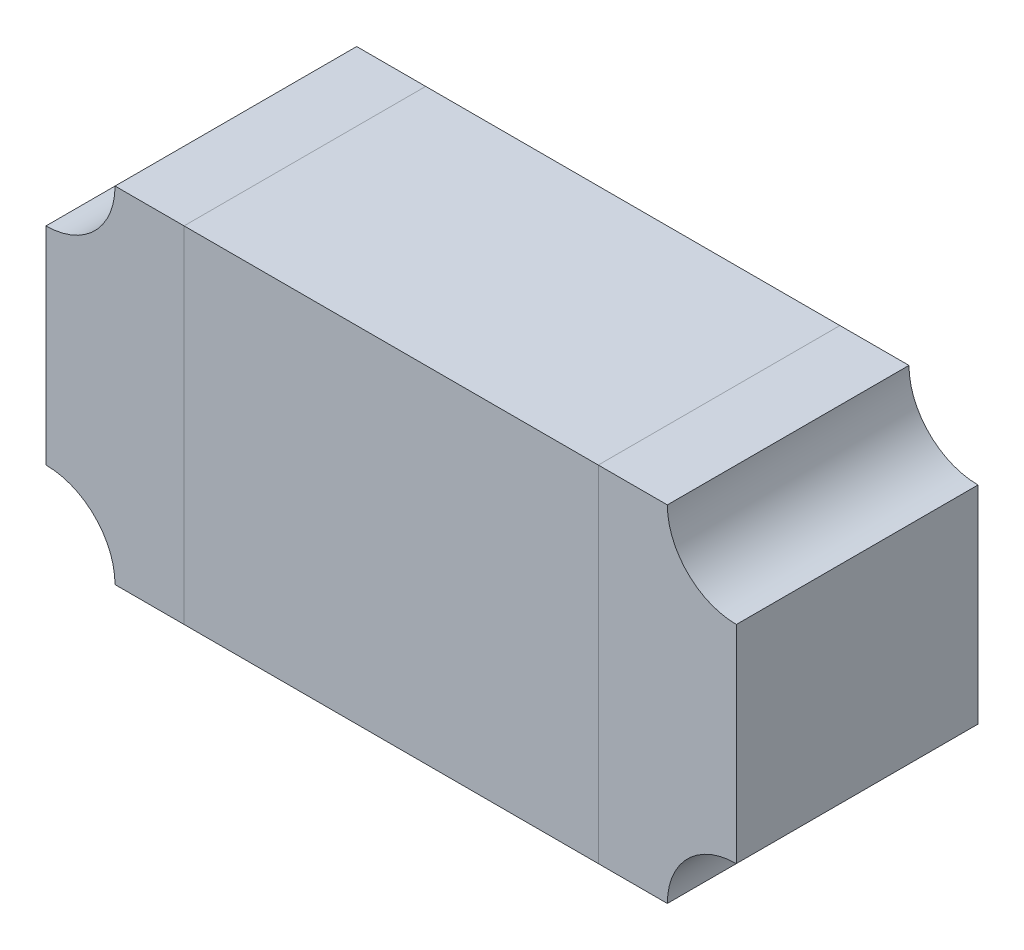
ISO-10303-21;
HEADER;
FILE_DESCRIPTION(('STEP AP214'),'2;1');
FILE_NAME('part.step','',(''),(''),'','','');
FILE_SCHEMA(('AUTOMOTIVE_DESIGN { 1 0 10303 214 1 1 1 1 }'));
ENDSEC;
DATA;
#1=APPLICATION_CONTEXT('core data for automotive mechanical design processes');
#2=APPLICATION_PROTOCOL_DEFINITION('international standard','automotive_design',2000,#1);
#3=PRODUCT_CONTEXT('',#1,'mechanical');
#4=PRODUCT('Part','Part','',(#3));
#5=PRODUCT_RELATED_PRODUCT_CATEGORY('part','',(#4));
#6=PRODUCT_DEFINITION_FORMATION('','',#4);
#7=PRODUCT_DEFINITION_CONTEXT('part definition',#1,'design');
#8=PRODUCT_DEFINITION('design','',#6,#7);
#9=PRODUCT_DEFINITION_SHAPE('','',#8);
#10=(LENGTH_UNIT() NAMED_UNIT(*) SI_UNIT(.MILLI.,.METRE.));
#11=(NAMED_UNIT(*) PLANE_ANGLE_UNIT() SI_UNIT($,.RADIAN.));
#12=(NAMED_UNIT(*) SI_UNIT($,.STERADIAN.) SOLID_ANGLE_UNIT());
#13=UNCERTAINTY_MEASURE_WITH_UNIT(LENGTH_MEASURE(1.E-05),#10,'distance_accuracy_value','');
#14=(GEOMETRIC_REPRESENTATION_CONTEXT(3) GLOBAL_UNCERTAINTY_ASSIGNED_CONTEXT((#13)) GLOBAL_UNIT_ASSIGNED_CONTEXT((#10,
#11,#12)) REPRESENTATION_CONTEXT('',''));
#15=CARTESIAN_POINT('',(0.,0.,0.));
#16=DIRECTION('',(0.,0.,1.));
#17=DIRECTION('',(1.,0.,0.));
#18=AXIS2_PLACEMENT_3D('',#15,#16,#17);
#19=CARTESIAN_POINT('',(0.5,0.25,0.));
#20=DIRECTION('',(0.,0.,-1.));
#21=DIRECTION('',(-1.,0.,0.));
#22=AXIS2_PLACEMENT_3D('',#19,#20,#21);
#23=PLANE('',#22);
#24=CARTESIAN_POINT('',(0.5,0.25,0.));
#25=DIRECTION('',(0.,0.,-1.));
#26=DIRECTION('',(-1.,0.,0.));
#27=AXIS2_PLACEMENT_3D('',#24,#25,#26);
#28=CIRCLE('',#27,0.1);
#29=CARTESIAN_POINT('',(0.5,0.15,0.));
#30=VERTEX_POINT('',#29);
#31=CARTESIAN_POINT('',(0.4,0.25,0.));
#32=VERTEX_POINT('',#31);
#33=EDGE_CURVE('E112',#30,#32,#28,.T.);
#34=ORIENTED_EDGE('',*,*,#33,.F.);
#35=DIRECTION('',(0.,1.,0.));
#36=VECTOR('',#35,1.);
#37=CARTESIAN_POINT('',(0.5,-0.15,0.));
#38=LINE('',#37,#36);
#39=CARTESIAN_POINT('',(0.5,-0.15,0.));
#40=VERTEX_POINT('',#39);
#41=EDGE_CURVE('E130',#40,#30,#38,.T.);
#42=ORIENTED_EDGE('',*,*,#41,.F.);
#43=CARTESIAN_POINT('',(0.5,-0.25,0.));
#44=DIRECTION('',(0.,0.,-1.));
#45=DIRECTION('',(1.,0.,0.));
#46=AXIS2_PLACEMENT_3D('',#43,#44,#45);
#47=CIRCLE('',#46,0.1);
#48=CARTESIAN_POINT('',(0.4,-0.25,0.));
#49=VERTEX_POINT('',#48);
#50=EDGE_CURVE('E127',#49,#40,#47,.T.);
#51=ORIENTED_EDGE('',*,*,#50,.F.);
#52=DIRECTION('',(1.,0.,0.));
#53=VECTOR('',#52,1.);
#54=CARTESIAN_POINT('',(0.3,-0.25,0.));
#55=LINE('',#54,#53);
#56=CARTESIAN_POINT('',(0.3,-0.25,0.));
#57=VERTEX_POINT('',#56);
#58=EDGE_CURVE('E124',#57,#49,#55,.T.);
#59=ORIENTED_EDGE('',*,*,#58,.F.);
#60=DIRECTION('',(0.,-1.,0.));
#61=VECTOR('',#60,1.);
#62=CARTESIAN_POINT('',(0.3,0.25,0.));
#63=LINE('',#62,#61);
#64=CARTESIAN_POINT('',(0.3,0.25,0.));
#65=VERTEX_POINT('',#64);
#66=EDGE_CURVE('E115',#65,#57,#63,.T.);
#67=ORIENTED_EDGE('',*,*,#66,.F.);
#68=DIRECTION('',(-1.,0.,0.));
#69=VECTOR('',#68,1.);
#70=CARTESIAN_POINT('',(0.4,0.25,0.));
#71=LINE('',#70,#69);
#72=EDGE_CURVE('E104',#32,#65,#71,.T.);
#73=ORIENTED_EDGE('',*,*,#72,.F.);
#74=EDGE_LOOP('',(#34,#42,#51,#59,#67,#73));
#75=FACE_BOUND('',#74,.T.);
#76=ADVANCED_FACE('F48',(#75),#23,.T.);
#77=CARTESIAN_POINT('',(0.5,-0.15,0.88851648071345));
#78=DIRECTION('',(-1.,0.,0.));
#79=DIRECTION('',(0.,-1.,0.));
#80=AXIS2_PLACEMENT_3D('',#77,#78,#79);
#81=PLANE('',#80);
#82=DIRECTION('',(0.,0.,-1.));
#83=VECTOR('',#82,1.);
#84=CARTESIAN_POINT('',(0.5,0.15,0.88851648071345));
#85=LINE('',#84,#83);
#86=CARTESIAN_POINT('',(0.5,0.15,0.35));
#87=VERTEX_POINT('',#86);
#88=EDGE_CURVE('E118',#87,#30,#85,.T.);
#89=ORIENTED_EDGE('',*,*,#88,.F.);
#90=DIRECTION('',(0.,-1.,0.));
#91=VECTOR('',#90,1.);
#92=CARTESIAN_POINT('',(0.5,-0.15,0.35));
#93=LINE('',#92,#91);
#94=CARTESIAN_POINT('',(0.5,-0.15,0.35));
#95=VERTEX_POINT('',#94);
#96=EDGE_CURVE('E52',#87,#95,#93,.T.);
#97=ORIENTED_EDGE('',*,*,#96,.T.);
#98=DIRECTION('',(0.,0.,-1.));
#99=VECTOR('',#98,1.);
#100=CARTESIAN_POINT('',(0.5,-0.15,0.88851648071345));
#101=LINE('',#100,#99);
#102=EDGE_CURVE('E133',#95,#40,#101,.T.);
#103=ORIENTED_EDGE('',*,*,#102,.T.);
#104=ORIENTED_EDGE('',*,*,#41,.T.);
#105=EDGE_LOOP('',(#89,#97,#103,#104));
#106=FACE_BOUND('',#105,.T.);
#107=ADVANCED_FACE('F152',(#106),#81,.F.);
#108=CARTESIAN_POINT('',(0.5,-0.25,0.88851648071345));
#109=DIRECTION('',(0.,0.,-1.));
#110=DIRECTION('',(-1.,0.,0.));
#111=AXIS2_PLACEMENT_3D('',#108,#109,#110);
#112=CYLINDRICAL_SURFACE('',#111,0.1);
#113=ORIENTED_EDGE('',*,*,#102,.F.);
#114=CARTESIAN_POINT('',(0.5,-0.25,0.35));
#115=DIRECTION('',(0.,0.,-1.));
#116=DIRECTION('',(-1.,0.,0.));
#117=AXIS2_PLACEMENT_3D('',#114,#115,#116);
#118=CIRCLE('',#117,0.1);
#119=CARTESIAN_POINT('',(0.4,-0.25,0.35));
#120=VERTEX_POINT('',#119);
#121=EDGE_CURVE('E144',#95,#120,#118,.F.);
#122=ORIENTED_EDGE('',*,*,#121,.T.);
#123=DIRECTION('',(0.,0.,-1.));
#124=VECTOR('',#123,1.);
#125=CARTESIAN_POINT('',(0.4,-0.25,0.88851648071345));
#126=LINE('',#125,#124);
#127=EDGE_CURVE('E135',#120,#49,#126,.T.);
#128=ORIENTED_EDGE('',*,*,#127,.T.);
#129=ORIENTED_EDGE('',*,*,#50,.T.);
#130=EDGE_LOOP('',(#113,#122,#128,#129));
#131=FACE_BOUND('',#130,.T.);
#132=ADVANCED_FACE('F155',(#131),#112,.F.);
#133=CARTESIAN_POINT('',(0.3,-0.25,0.88851648071345));
#134=DIRECTION('',(0.,1.,0.));
#135=DIRECTION('',(0.,0.,1.));
#136=AXIS2_PLACEMENT_3D('',#133,#134,#135);
#137=PLANE('',#136);
#138=ORIENTED_EDGE('',*,*,#127,.F.);
#139=DIRECTION('',(-1.,0.,0.));
#140=VECTOR('',#139,1.);
#141=CARTESIAN_POINT('',(0.3,-0.25,0.35));
#142=LINE('',#141,#140);
#143=CARTESIAN_POINT('',(0.3,-0.25,0.35));
#144=VERTEX_POINT('',#143);
#145=EDGE_CURVE('E142',#120,#144,#142,.T.);
#146=ORIENTED_EDGE('',*,*,#145,.T.);
#147=DIRECTION('',(0.,0.,-1.));
#148=VECTOR('',#147,1.);
#149=CARTESIAN_POINT('',(0.3,-0.25,0.88851648071345));
#150=LINE('',#149,#148);
#151=EDGE_CURVE('E137',#144,#57,#150,.T.);
#152=ORIENTED_EDGE('',*,*,#151,.T.);
#153=ORIENTED_EDGE('',*,*,#58,.T.);
#154=EDGE_LOOP('',(#138,#146,#152,#153));
#155=FACE_BOUND('',#154,.T.);
#156=ADVANCED_FACE('F158',(#155),#137,.F.);
#157=CARTESIAN_POINT('',(0.3,0.25,0.88851648071345));
#158=DIRECTION('',(1.,0.,0.));
#159=DIRECTION('',(0.,0.,-1.));
#160=AXIS2_PLACEMENT_3D('',#157,#158,#159);
#161=PLANE('',#160);
#162=ORIENTED_EDGE('',*,*,#151,.F.);
#163=DIRECTION('',(0.,1.,0.));
#164=VECTOR('',#163,1.);
#165=CARTESIAN_POINT('',(0.3,0.25,0.35));
#166=LINE('',#165,#164);
#167=CARTESIAN_POINT('',(0.3,0.25,0.35));
#168=VERTEX_POINT('',#167);
#169=EDGE_CURVE('E69',#144,#168,#166,.T.);
#170=ORIENTED_EDGE('',*,*,#169,.T.);
#171=DIRECTION('',(0.,0.,-1.));
#172=VECTOR('',#171,1.);
#173=CARTESIAN_POINT('',(0.3,0.25,0.88851648071345));
#174=LINE('',#173,#172);
#175=EDGE_CURVE('E108',#168,#65,#174,.T.);
#176=ORIENTED_EDGE('',*,*,#175,.T.);
#177=ORIENTED_EDGE('',*,*,#66,.T.);
#178=EDGE_LOOP('',(#162,#170,#176,#177));
#179=FACE_BOUND('',#178,.T.);
#180=ADVANCED_FACE('F140',(#179),#161,.F.);
#181=CARTESIAN_POINT('',(0.4,0.25,0.88851648071345));
#182=DIRECTION('',(0.,-1.,0.));
#183=DIRECTION('',(0.,0.,-1.));
#184=AXIS2_PLACEMENT_3D('',#181,#182,#183);
#185=PLANE('',#184);
#186=ORIENTED_EDGE('',*,*,#175,.F.);
#187=DIRECTION('',(1.,0.,0.));
#188=VECTOR('',#187,1.);
#189=CARTESIAN_POINT('',(0.4,0.25,0.35));
#190=LINE('',#189,#188);
#191=CARTESIAN_POINT('',(0.4,0.25,0.35));
#192=VERTEX_POINT('',#191);
#193=EDGE_CURVE('E57',#168,#192,#190,.T.);
#194=ORIENTED_EDGE('',*,*,#193,.T.);
#195=DIRECTION('',(0.,0.,-1.));
#196=VECTOR('',#195,1.);
#197=CARTESIAN_POINT('',(0.4,0.25,0.88851648071345));
#198=LINE('',#197,#196);
#199=EDGE_CURVE('E101',#192,#32,#198,.T.);
#200=ORIENTED_EDGE('',*,*,#199,.T.);
#201=ORIENTED_EDGE('',*,*,#72,.T.);
#202=EDGE_LOOP('',(#186,#194,#200,#201));
#203=FACE_BOUND('',#202,.T.);
#204=ADVANCED_FACE('F103',(#203),#185,.F.);
#205=CARTESIAN_POINT('',(0.5,0.25,0.88851648071345));
#206=DIRECTION('',(0.,0.,-1.));
#207=DIRECTION('',(-1.,0.,0.));
#208=AXIS2_PLACEMENT_3D('',#205,#206,#207);
#209=CYLINDRICAL_SURFACE('',#208,0.1);
#210=ORIENTED_EDGE('',*,*,#199,.F.);
#211=CARTESIAN_POINT('',(0.5,0.25,0.35));
#212=DIRECTION('',(0.,0.,-1.));
#213=DIRECTION('',(-1.,0.,0.));
#214=AXIS2_PLACEMENT_3D('',#211,#212,#213);
#215=CIRCLE('',#214,0.1);
#216=EDGE_CURVE('E12',#192,#87,#215,.F.);
#217=ORIENTED_EDGE('',*,*,#216,.T.);
#218=ORIENTED_EDGE('',*,*,#88,.T.);
#219=ORIENTED_EDGE('',*,*,#33,.T.);
#220=EDGE_LOOP('',(#210,#217,#218,#219));
#221=FACE_BOUND('',#220,.T.);
#222=ADVANCED_FACE('F50',(#221),#209,.F.);
#223=CARTESIAN_POINT('',(0.,0.,0.35));
#224=DIRECTION('',(0.,0.,-1.));
#225=DIRECTION('',(-1.,0.,0.));
#226=AXIS2_PLACEMENT_3D('',#223,#224,#225);
#227=PLANE('',#226);
#228=ORIENTED_EDGE('',*,*,#193,.F.);
#229=ORIENTED_EDGE('',*,*,#169,.F.);
#230=ORIENTED_EDGE('',*,*,#145,.F.);
#231=ORIENTED_EDGE('',*,*,#121,.F.);
#232=ORIENTED_EDGE('',*,*,#96,.F.);
#233=ORIENTED_EDGE('',*,*,#216,.F.);
#234=EDGE_LOOP('',(#228,#229,#230,#231,#232,#233));
#235=FACE_BOUND('',#234,.T.);
#236=ADVANCED_FACE('F153',(#235),#227,.F.);
#237=CLOSED_SHELL('',(#76,#107,#132,#156,#180,#204,#222,#236));
#238=MANIFOLD_SOLID_BREP('B2',#237);
#239=CARTESIAN_POINT('',(-0.5,-0.25,0.));
#240=DIRECTION('',(0.,0.,-1.));
#241=DIRECTION('',(-1.,0.,0.));
#242=AXIS2_PLACEMENT_3D('',#239,#240,#241);
#243=PLANE('',#242);
#244=DIRECTION('',(0.,1.,0.));
#245=VECTOR('',#244,1.);
#246=CARTESIAN_POINT('',(-0.3,0.25,0.));
#247=LINE('',#246,#245);
#248=CARTESIAN_POINT('',(-0.3,-0.25,0.));
#249=VERTEX_POINT('',#248);
#250=CARTESIAN_POINT('',(-0.3,0.25,0.));
#251=VERTEX_POINT('',#250);
#252=EDGE_CURVE('E297',#249,#251,#247,.T.);
#253=ORIENTED_EDGE('',*,*,#252,.F.);
#254=DIRECTION('',(1.,0.,0.));
#255=VECTOR('',#254,1.);
#256=CARTESIAN_POINT('',(-0.3,-0.25,0.));
#257=LINE('',#256,#255);
#258=CARTESIAN_POINT('',(-0.4,-0.25,0.));
#259=VERTEX_POINT('',#258);
#260=EDGE_CURVE('E315',#259,#249,#257,.T.);
#261=ORIENTED_EDGE('',*,*,#260,.F.);
#262=CARTESIAN_POINT('',(-0.5,-0.25,0.));
#263=DIRECTION('',(0.,0.,-1.));
#264=DIRECTION('',(-1.,0.,0.));
#265=AXIS2_PLACEMENT_3D('',#262,#263,#264);
#266=CIRCLE('',#265,0.1);
#267=CARTESIAN_POINT('',(-0.5,-0.15,0.));
#268=VERTEX_POINT('',#267);
#269=EDGE_CURVE('E312',#268,#259,#266,.T.);
#270=ORIENTED_EDGE('',*,*,#269,.F.);
#271=DIRECTION('',(0.,-1.,0.));
#272=VECTOR('',#271,1.);
#273=CARTESIAN_POINT('',(-0.5,-0.15,0.));
#274=LINE('',#273,#272);
#275=CARTESIAN_POINT('',(-0.5,0.15,0.));
#276=VERTEX_POINT('',#275);
#277=EDGE_CURVE('E309',#276,#268,#274,.T.);
#278=ORIENTED_EDGE('',*,*,#277,.F.);
#279=CARTESIAN_POINT('',(-0.5,0.25,0.));
#280=DIRECTION('',(0.,0.,-1.));
#281=DIRECTION('',(1.,0.,0.));
#282=AXIS2_PLACEMENT_3D('',#279,#280,#281);
#283=CIRCLE('',#282,0.1);
#284=CARTESIAN_POINT('',(-0.4,0.25,0.));
#285=VERTEX_POINT('',#284);
#286=EDGE_CURVE('E300',#285,#276,#283,.T.);
#287=ORIENTED_EDGE('',*,*,#286,.F.);
#288=DIRECTION('',(-1.,0.,0.));
#289=VECTOR('',#288,1.);
#290=CARTESIAN_POINT('',(-0.4,0.25,0.));
#291=LINE('',#290,#289);
#292=EDGE_CURVE('E289',#251,#285,#291,.T.);
#293=ORIENTED_EDGE('',*,*,#292,.F.);
#294=EDGE_LOOP('',(#253,#261,#270,#278,#287,#293));
#295=FACE_BOUND('',#294,.T.);
#296=ADVANCED_FACE('F233',(#295),#243,.T.);
#297=CARTESIAN_POINT('',(-0.3,-0.25,0.88851648071345));
#298=DIRECTION('',(0.,1.,0.));
#299=DIRECTION('',(0.,0.,1.));
#300=AXIS2_PLACEMENT_3D('',#297,#298,#299);
#301=PLANE('',#300);
#302=DIRECTION('',(0.,0.,-1.));
#303=VECTOR('',#302,1.);
#304=CARTESIAN_POINT('',(-0.3,-0.25,0.88851648071345));
#305=LINE('',#304,#303);
#306=CARTESIAN_POINT('',(-0.3,-0.25,0.35));
#307=VERTEX_POINT('',#306);
#308=EDGE_CURVE('E303',#307,#249,#305,.T.);
#309=ORIENTED_EDGE('',*,*,#308,.F.);
#310=DIRECTION('',(-1.,0.,0.));
#311=VECTOR('',#310,1.);
#312=CARTESIAN_POINT('',(-0.3,-0.25,0.35));
#313=LINE('',#312,#311);
#314=CARTESIAN_POINT('',(-0.4,-0.25,0.35));
#315=VERTEX_POINT('',#314);
#316=EDGE_CURVE('E237',#307,#315,#313,.T.);
#317=ORIENTED_EDGE('',*,*,#316,.T.);
#318=DIRECTION('',(0.,0.,-1.));
#319=VECTOR('',#318,1.);
#320=CARTESIAN_POINT('',(-0.4,-0.25,0.88851648071345));
#321=LINE('',#320,#319);
#322=EDGE_CURVE('E318',#315,#259,#321,.T.);
#323=ORIENTED_EDGE('',*,*,#322,.T.);
#324=ORIENTED_EDGE('',*,*,#260,.T.);
#325=EDGE_LOOP('',(#309,#317,#323,#324));
#326=FACE_BOUND('',#325,.T.);
#327=ADVANCED_FACE('F337',(#326),#301,.F.);
#328=CARTESIAN_POINT('',(-0.5,-0.25,0.88851648071345));
#329=DIRECTION('',(0.,0.,-1.));
#330=DIRECTION('',(-1.,0.,0.));
#331=AXIS2_PLACEMENT_3D('',#328,#329,#330);
#332=CYLINDRICAL_SURFACE('',#331,0.1);
#333=ORIENTED_EDGE('',*,*,#322,.F.);
#334=CARTESIAN_POINT('',(-0.5,-0.25,0.35));
#335=DIRECTION('',(0.,0.,-1.));
#336=DIRECTION('',(-1.,0.,0.));
#337=AXIS2_PLACEMENT_3D('',#334,#335,#336);
#338=CIRCLE('',#337,0.1);
#339=CARTESIAN_POINT('',(-0.5,-0.15,0.35));
#340=VERTEX_POINT('',#339);
#341=EDGE_CURVE('E329',#315,#340,#338,.F.);
#342=ORIENTED_EDGE('',*,*,#341,.T.);
#343=DIRECTION('',(0.,0.,-1.));
#344=VECTOR('',#343,1.);
#345=CARTESIAN_POINT('',(-0.5,-0.15,0.88851648071345));
#346=LINE('',#345,#344);
#347=EDGE_CURVE('E320',#340,#268,#346,.T.);
#348=ORIENTED_EDGE('',*,*,#347,.T.);
#349=ORIENTED_EDGE('',*,*,#269,.T.);
#350=EDGE_LOOP('',(#333,#342,#348,#349));
#351=FACE_BOUND('',#350,.T.);
#352=ADVANCED_FACE('F340',(#351),#332,.F.);
#353=CARTESIAN_POINT('',(-0.5,-0.15,0.88851648071345));
#354=DIRECTION('',(1.,0.,0.));
#355=DIRECTION('',(0.,1.,0.));
#356=AXIS2_PLACEMENT_3D('',#353,#354,#355);
#357=PLANE('',#356);
#358=ORIENTED_EDGE('',*,*,#347,.F.);
#359=DIRECTION('',(0.,1.,0.));
#360=VECTOR('',#359,1.);
#361=CARTESIAN_POINT('',(-0.5,-0.15,0.35));
#362=LINE('',#361,#360);
#363=CARTESIAN_POINT('',(-0.5,0.15,0.35));
#364=VERTEX_POINT('',#363);
#365=EDGE_CURVE('E327',#340,#364,#362,.T.);
#366=ORIENTED_EDGE('',*,*,#365,.T.);
#367=DIRECTION('',(0.,0.,-1.));
#368=VECTOR('',#367,1.);
#369=CARTESIAN_POINT('',(-0.5,0.15,0.88851648071345));
#370=LINE('',#369,#368);
#371=EDGE_CURVE('E322',#364,#276,#370,.T.);
#372=ORIENTED_EDGE('',*,*,#371,.T.);
#373=ORIENTED_EDGE('',*,*,#277,.T.);
#374=EDGE_LOOP('',(#358,#366,#372,#373));
#375=FACE_BOUND('',#374,.T.);
#376=ADVANCED_FACE('F343',(#375),#357,.F.);
#377=CARTESIAN_POINT('',(-0.5,0.25,0.88851648071345));
#378=DIRECTION('',(0.,0.,-1.));
#379=DIRECTION('',(-1.,0.,0.));
#380=AXIS2_PLACEMENT_3D('',#377,#378,#379);
#381=CYLINDRICAL_SURFACE('',#380,0.1);
#382=ORIENTED_EDGE('',*,*,#371,.F.);
#383=CARTESIAN_POINT('',(-0.5,0.25,0.35));
#384=DIRECTION('',(0.,0.,-1.));
#385=DIRECTION('',(-1.,0.,0.));
#386=AXIS2_PLACEMENT_3D('',#383,#384,#385);
#387=CIRCLE('',#386,0.1);
#388=CARTESIAN_POINT('',(-0.4,0.25,0.35));
#389=VERTEX_POINT('',#388);
#390=EDGE_CURVE('E254',#364,#389,#387,.F.);
#391=ORIENTED_EDGE('',*,*,#390,.T.);
#392=DIRECTION('',(0.,0.,-1.));
#393=VECTOR('',#392,1.);
#394=CARTESIAN_POINT('',(-0.4,0.25,0.88851648071345));
#395=LINE('',#394,#393);
#396=EDGE_CURVE('E293',#389,#285,#395,.T.);
#397=ORIENTED_EDGE('',*,*,#396,.T.);
#398=ORIENTED_EDGE('',*,*,#286,.T.);
#399=EDGE_LOOP('',(#382,#391,#397,#398));
#400=FACE_BOUND('',#399,.T.);
#401=ADVANCED_FACE('F325',(#400),#381,.F.);
#402=CARTESIAN_POINT('',(-0.4,0.25,0.88851648071345));
#403=DIRECTION('',(0.,-1.,0.));
#404=DIRECTION('',(0.,0.,-1.));
#405=AXIS2_PLACEMENT_3D('',#402,#403,#404);
#406=PLANE('',#405);
#407=ORIENTED_EDGE('',*,*,#396,.F.);
#408=DIRECTION('',(1.,0.,0.));
#409=VECTOR('',#408,1.);
#410=CARTESIAN_POINT('',(-0.4,0.25,0.35));
#411=LINE('',#410,#409);
#412=CARTESIAN_POINT('',(-0.3,0.25,0.35));
#413=VERTEX_POINT('',#412);
#414=EDGE_CURVE('E242',#389,#413,#411,.T.);
#415=ORIENTED_EDGE('',*,*,#414,.T.);
#416=DIRECTION('',(0.,0.,-1.));
#417=VECTOR('',#416,1.);
#418=CARTESIAN_POINT('',(-0.3,0.25,0.88851648071345));
#419=LINE('',#418,#417);
#420=EDGE_CURVE('E286',#413,#251,#419,.T.);
#421=ORIENTED_EDGE('',*,*,#420,.T.);
#422=ORIENTED_EDGE('',*,*,#292,.T.);
#423=EDGE_LOOP('',(#407,#415,#421,#422));
#424=FACE_BOUND('',#423,.T.);
#425=ADVANCED_FACE('F288',(#424),#406,.F.);
#426=CARTESIAN_POINT('',(-0.3,0.25,0.88851648071345));
#427=DIRECTION('',(-1.,0.,0.));
#428=DIRECTION('',(0.,0.,1.));
#429=AXIS2_PLACEMENT_3D('',#426,#427,#428);
#430=PLANE('',#429);
#431=ORIENTED_EDGE('',*,*,#420,.F.);
#432=DIRECTION('',(0.,-1.,0.));
#433=VECTOR('',#432,1.);
#434=CARTESIAN_POINT('',(-0.3,0.25,0.35));
#435=LINE('',#434,#433);
#436=EDGE_CURVE('E46',#413,#307,#435,.T.);
#437=ORIENTED_EDGE('',*,*,#436,.T.);
#438=ORIENTED_EDGE('',*,*,#308,.T.);
#439=ORIENTED_EDGE('',*,*,#252,.T.);
#440=EDGE_LOOP('',(#431,#437,#438,#439));
#441=FACE_BOUND('',#440,.T.);
#442=ADVANCED_FACE('F235',(#441),#430,.F.);
#443=CARTESIAN_POINT('',(0.,0.,0.35));
#444=DIRECTION('',(0.,0.,-1.));
#445=DIRECTION('',(-1.,0.,0.));
#446=AXIS2_PLACEMENT_3D('',#443,#444,#445);
#447=PLANE('',#446);
#448=ORIENTED_EDGE('',*,*,#414,.F.);
#449=ORIENTED_EDGE('',*,*,#390,.F.);
#450=ORIENTED_EDGE('',*,*,#365,.F.);
#451=ORIENTED_EDGE('',*,*,#341,.F.);
#452=ORIENTED_EDGE('',*,*,#316,.F.);
#453=ORIENTED_EDGE('',*,*,#436,.F.);
#454=EDGE_LOOP('',(#448,#449,#450,#451,#452,#453));
#455=FACE_BOUND('',#454,.T.);
#456=ADVANCED_FACE('F338',(#455),#447,.F.);
#457=CLOSED_SHELL('',(#296,#327,#352,#376,#401,#425,#442,#456));
#458=MANIFOLD_SOLID_BREP('B6',#457);
#459=CARTESIAN_POINT('',(0.3,-0.25,0.35));
#460=DIRECTION('',(-1.,0.,0.));
#461=DIRECTION('',(0.,0.,1.));
#462=AXIS2_PLACEMENT_3D('',#459,#460,#461);
#463=PLANE('',#462);
#464=DIRECTION('',(0.,1.,0.));
#465=VECTOR('',#464,1.);
#466=CARTESIAN_POINT('',(0.3,-0.25,0.));
#467=LINE('',#466,#465);
#468=CARTESIAN_POINT('',(0.3,-0.25,0.));
#469=VERTEX_POINT('',#468);
#470=CARTESIAN_POINT('',(0.3,0.25,0.));
#471=VERTEX_POINT('',#470);
#472=EDGE_CURVE('E472',#469,#471,#467,.T.);
#473=ORIENTED_EDGE('',*,*,#472,.T.);
#474=DIRECTION('',(0.,0.,-1.));
#475=VECTOR('',#474,1.);
#476=CARTESIAN_POINT('',(0.3,0.25,0.35));
#477=LINE('',#476,#475);
#478=CARTESIAN_POINT('',(0.3,0.25,0.35));
#479=VERTEX_POINT('',#478);
#480=EDGE_CURVE('E231',#479,#471,#477,.T.);
#481=ORIENTED_EDGE('',*,*,#480,.F.);
#482=DIRECTION('',(0.,1.,0.));
#483=VECTOR('',#482,1.);
#484=CARTESIAN_POINT('',(0.3,-0.25,0.35));
#485=LINE('',#484,#483);
#486=CARTESIAN_POINT('',(0.3,-0.25,0.35));
#487=VERTEX_POINT('',#486);
#488=EDGE_CURVE('E460',#487,#479,#485,.T.);
#489=ORIENTED_EDGE('',*,*,#488,.F.);
#490=DIRECTION('',(0.,0.,-1.));
#491=VECTOR('',#490,1.);
#492=CARTESIAN_POINT('',(0.3,-0.25,0.35));
#493=LINE('',#492,#491);
#494=EDGE_CURVE('E468',#487,#469,#493,.T.);
#495=ORIENTED_EDGE('',*,*,#494,.T.);
#496=EDGE_LOOP('',(#473,#481,#489,#495));
#497=FACE_BOUND('',#496,.T.);
#498=ADVANCED_FACE('F409',(#497),#463,.F.);
#499=CARTESIAN_POINT('',(-0.3,0.25,0.35));
#500=DIRECTION('',(0.,-1.,0.));
#501=DIRECTION('',(0.,0.,-1.));
#502=AXIS2_PLACEMENT_3D('',#499,#500,#501);
#503=PLANE('',#502);
#504=DIRECTION('',(-1.,0.,0.));
#505=VECTOR('',#504,1.);
#506=CARTESIAN_POINT('',(-0.3,0.25,0.));
#507=LINE('',#506,#505);
#508=CARTESIAN_POINT('',(-0.3,0.25,0.));
#509=VERTEX_POINT('',#508);
#510=EDGE_CURVE('E464',#471,#509,#507,.T.);
#511=ORIENTED_EDGE('',*,*,#510,.T.);
#512=DIRECTION('',(0.,0.,-1.));
#513=VECTOR('',#512,1.);
#514=CARTESIAN_POINT('',(-0.3,0.25,0.35));
#515=LINE('',#514,#513);
#516=CARTESIAN_POINT('',(-0.3,0.25,0.35));
#517=VERTEX_POINT('',#516);
#518=EDGE_CURVE('E417',#517,#509,#515,.T.);
#519=ORIENTED_EDGE('',*,*,#518,.F.);
#520=DIRECTION('',(-1.,0.,0.));
#521=VECTOR('',#520,1.);
#522=CARTESIAN_POINT('',(-0.3,0.25,0.35));
#523=LINE('',#522,#521);
#524=EDGE_CURVE('E455',#479,#517,#523,.T.);
#525=ORIENTED_EDGE('',*,*,#524,.F.);
#526=ORIENTED_EDGE('',*,*,#480,.T.);
#527=EDGE_LOOP('',(#511,#519,#525,#526));
#528=FACE_BOUND('',#527,.T.);
#529=ADVANCED_FACE('F463',(#528),#503,.F.);
#530=CARTESIAN_POINT('',(-0.3,-0.25,0.35));
#531=DIRECTION('',(1.,0.,0.));
#532=DIRECTION('',(0.,0.,-1.));
#533=AXIS2_PLACEMENT_3D('',#530,#531,#532);
#534=PLANE('',#533);
#535=DIRECTION('',(0.,-1.,0.));
#536=VECTOR('',#535,1.);
#537=CARTESIAN_POINT('',(-0.3,-0.25,0.));
#538=LINE('',#537,#536);
#539=CARTESIAN_POINT('',(-0.3,-0.25,0.));
#540=VERTEX_POINT('',#539);
#541=EDGE_CURVE('E442',#509,#540,#538,.T.);
#542=ORIENTED_EDGE('',*,*,#541,.T.);
#543=DIRECTION('',(0.,0.,-1.));
#544=VECTOR('',#543,1.);
#545=CARTESIAN_POINT('',(-0.3,-0.25,0.35));
#546=LINE('',#545,#544);
#547=CARTESIAN_POINT('',(-0.3,-0.25,0.35));
#548=VERTEX_POINT('',#547);
#549=EDGE_CURVE('E465',#548,#540,#546,.T.);
#550=ORIENTED_EDGE('',*,*,#549,.F.);
#551=DIRECTION('',(0.,-1.,0.));
#552=VECTOR('',#551,1.);
#553=CARTESIAN_POINT('',(-0.3,-0.25,0.35));
#554=LINE('',#553,#552);
#555=EDGE_CURVE('E458',#517,#548,#554,.T.);
#556=ORIENTED_EDGE('',*,*,#555,.F.);
#557=ORIENTED_EDGE('',*,*,#518,.T.);
#558=EDGE_LOOP('',(#542,#550,#556,#557));
#559=FACE_BOUND('',#558,.T.);
#560=ADVANCED_FACE('F466',(#559),#534,.F.);
#561=CARTESIAN_POINT('',(-0.3,-0.25,0.35));
#562=DIRECTION('',(0.,1.,0.));
#563=DIRECTION('',(0.,0.,1.));
#564=AXIS2_PLACEMENT_3D('',#561,#562,#563);
#565=PLANE('',#564);
#566=DIRECTION('',(1.,0.,0.));
#567=VECTOR('',#566,1.);
#568=CARTESIAN_POINT('',(-0.3,-0.25,0.));
#569=LINE('',#568,#567);
#570=EDGE_CURVE('E448',#540,#469,#569,.T.);
#571=ORIENTED_EDGE('',*,*,#570,.T.);
#572=ORIENTED_EDGE('',*,*,#494,.F.);
#573=DIRECTION('',(1.,0.,0.));
#574=VECTOR('',#573,1.);
#575=CARTESIAN_POINT('',(-0.3,-0.25,0.35));
#576=LINE('',#575,#574);
#577=EDGE_CURVE('E425',#548,#487,#576,.T.);
#578=ORIENTED_EDGE('',*,*,#577,.F.);
#579=ORIENTED_EDGE('',*,*,#549,.T.);
#580=EDGE_LOOP('',(#571,#572,#578,#579));
#581=FACE_BOUND('',#580,.T.);
#582=ADVANCED_FACE('F479',(#581),#565,.F.);
#583=CARTESIAN_POINT('',(0.,0.,0.35));
#584=DIRECTION('',(0.,0.,-1.));
#585=DIRECTION('',(-1.,0.,0.));
#586=AXIS2_PLACEMENT_3D('',#583,#584,#585);
#587=PLANE('',#586);
#588=ORIENTED_EDGE('',*,*,#488,.T.);
#589=ORIENTED_EDGE('',*,*,#524,.T.);
#590=ORIENTED_EDGE('',*,*,#555,.T.);
#591=ORIENTED_EDGE('',*,*,#577,.T.);
#592=EDGE_LOOP('',(#588,#589,#590,#591));
#593=FACE_BOUND('',#592,.T.);
#594=ADVANCED_FACE('F456',(#593),#587,.F.);
#595=CARTESIAN_POINT('',(0.,0.,0.));
#596=DIRECTION('',(0.,0.,-1.));
#597=DIRECTION('',(-1.,0.,0.));
#598=AXIS2_PLACEMENT_3D('',#595,#596,#597);
#599=PLANE('',#598);
#600=ORIENTED_EDGE('',*,*,#472,.F.);
#601=ORIENTED_EDGE('',*,*,#570,.F.);
#602=ORIENTED_EDGE('',*,*,#541,.F.);
#603=ORIENTED_EDGE('',*,*,#510,.F.);
#604=EDGE_LOOP('',(#600,#601,#602,#603));
#605=FACE_BOUND('',#604,.T.);
#606=ADVANCED_FACE('F482',(#605),#599,.T.);
#607=CLOSED_SHELL('',(#498,#529,#560,#582,#594,#606));
#608=MANIFOLD_SOLID_BREP('B40',#607);
#609=ADVANCED_BREP_SHAPE_REPRESENTATION('',(#18,#238,#458,#608),#14);
#610=SHAPE_DEFINITION_REPRESENTATION(#9,#609);
ENDSEC;
END-ISO-10303-21;
